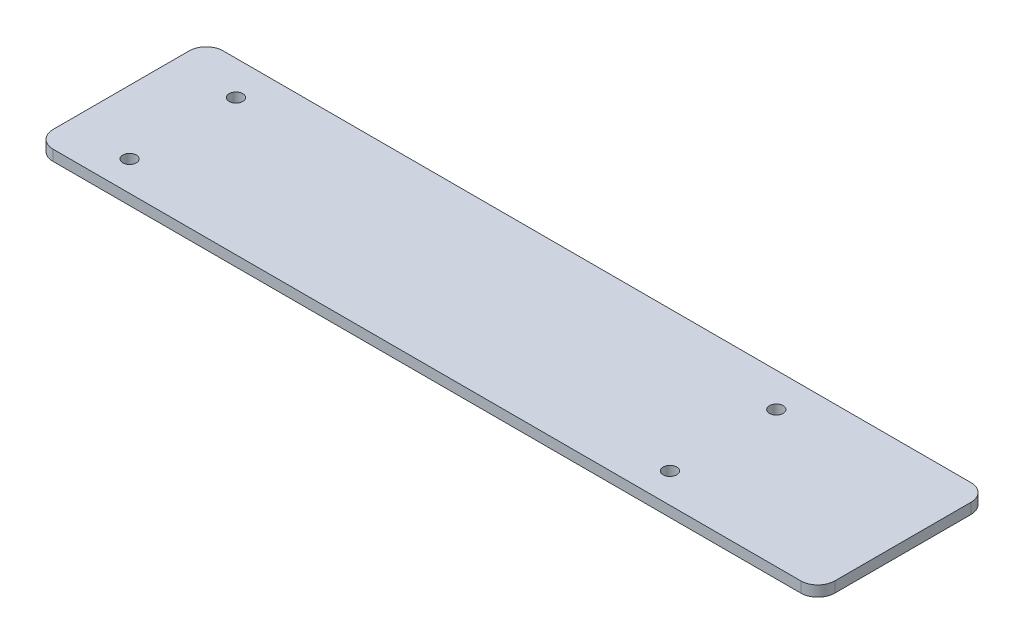
ISO-10303-21;
HEADER;
FILE_DESCRIPTION(('STEP AP214'),'2;1');
FILE_NAME('part.step','',(''),(''),'','','');
FILE_SCHEMA(('AUTOMOTIVE_DESIGN { 1 0 10303 214 1 1 1 1 }'));
ENDSEC;
DATA;
#1=APPLICATION_CONTEXT('core data for automotive mechanical design processes');
#2=APPLICATION_PROTOCOL_DEFINITION('international standard','automotive_design',2000,#1);
#3=PRODUCT_CONTEXT('',#1,'mechanical');
#4=PRODUCT('Part','Part','',(#3));
#5=PRODUCT_RELATED_PRODUCT_CATEGORY('part','',(#4));
#6=PRODUCT_DEFINITION_FORMATION('','',#4);
#7=PRODUCT_DEFINITION_CONTEXT('part definition',#1,'design');
#8=PRODUCT_DEFINITION('design','',#6,#7);
#9=PRODUCT_DEFINITION_SHAPE('','',#8);
#10=(LENGTH_UNIT() NAMED_UNIT(*) SI_UNIT(.MILLI.,.METRE.));
#11=(NAMED_UNIT(*) PLANE_ANGLE_UNIT() SI_UNIT($,.RADIAN.));
#12=(NAMED_UNIT(*) SI_UNIT($,.STERADIAN.) SOLID_ANGLE_UNIT());
#13=UNCERTAINTY_MEASURE_WITH_UNIT(LENGTH_MEASURE(1.E-05),#10,'distance_accuracy_value','');
#14=(GEOMETRIC_REPRESENTATION_CONTEXT(3) GLOBAL_UNCERTAINTY_ASSIGNED_CONTEXT((#13)) GLOBAL_UNIT_ASSIGNED_CONTEXT((#10,
#11,#12)) REPRESENTATION_CONTEXT('',''));
#15=CARTESIAN_POINT('',(0.,0.,0.));
#16=DIRECTION('',(0.,0.,1.));
#17=DIRECTION('',(1.,0.,0.));
#18=AXIS2_PLACEMENT_3D('',#15,#16,#17);
#19=CARTESIAN_POINT('',(0.,3.175,0.));
#20=DIRECTION('',(0.,1.,0.));
#21=DIRECTION('',(0.,0.,1.));
#22=AXIS2_PLACEMENT_3D('',#19,#20,#21);
#23=PLANE('',#22);
#24=CARTESIAN_POINT('',(63.65875,3.175,16.51));
#25=DIRECTION('',(0.,1.,0.));
#26=DIRECTION('',(0.,0.,1.));
#27=AXIS2_PLACEMENT_3D('',#24,#25,#26);
#28=CIRCLE('',#27,2.03200000000002);
#29=CARTESIAN_POINT('',(63.65875,3.175,18.542));
#30=VERTEX_POINT('',#29);
#31=EDGE_CURVE('E227',#30,#30,#28,.T.);
#32=ORIENTED_EDGE('',*,*,#31,.F.);
#33=EDGE_LOOP('',(#32));
#34=FACE_BOUND('',#33,.T.);
#35=CARTESIAN_POINT('',(-97.63125,3.175,-15.24));
#36=DIRECTION('',(0.,1.,0.));
#37=DIRECTION('',(0.,0.,1.));
#38=AXIS2_PLACEMENT_3D('',#35,#36,#37);
#39=CIRCLE('',#38,2.03200000000001);
#40=CARTESIAN_POINT('',(-97.63125,3.175,-13.208));
#41=VERTEX_POINT('',#40);
#42=EDGE_CURVE('E161',#41,#41,#39,.T.);
#43=ORIENTED_EDGE('',*,*,#42,.F.);
#44=EDGE_LOOP('',(#43));
#45=FACE_BOUND('',#44,.T.);
#46=DIRECTION('',(0.,0.,-1.));
#47=VECTOR('',#46,1.);
#48=CARTESIAN_POINT('',(116.68125,3.175,-25.4));
#49=LINE('',#48,#47);
#50=CARTESIAN_POINT('',(116.68125,3.175,20.32));
#51=VERTEX_POINT('',#50);
#52=CARTESIAN_POINT('',(116.68125,3.175,-20.32));
#53=VERTEX_POINT('',#52);
#54=EDGE_CURVE('E170',#51,#53,#49,.T.);
#55=ORIENTED_EDGE('',*,*,#54,.T.);
#56=CARTESIAN_POINT('',(111.60125,3.175,-20.32));
#57=DIRECTION('',(0.,1.,0.));
#58=DIRECTION('',(0.,0.,1.));
#59=AXIS2_PLACEMENT_3D('',#56,#57,#58);
#60=CIRCLE('',#59,5.08);
#61=CARTESIAN_POINT('',(111.60125,3.175,-25.4));
#62=VERTEX_POINT('',#61);
#63=EDGE_CURVE('E190',#53,#62,#60,.T.);
#64=ORIENTED_EDGE('',*,*,#63,.T.);
#65=DIRECTION('',(-1.,0.,0.));
#66=VECTOR('',#65,1.);
#67=CARTESIAN_POINT('',(-116.68125,3.175,-25.4));
#68=LINE('',#67,#66);
#69=CARTESIAN_POINT('',(-111.60125,3.175,-25.4));
#70=VERTEX_POINT('',#69);
#71=EDGE_CURVE('E141',#62,#70,#68,.T.);
#72=ORIENTED_EDGE('',*,*,#71,.T.);
#73=CARTESIAN_POINT('',(-111.60125,3.175,-20.32));
#74=DIRECTION('',(0.,1.,0.));
#75=DIRECTION('',(0.,0.,1.));
#76=AXIS2_PLACEMENT_3D('',#73,#74,#75);
#77=CIRCLE('',#76,5.08);
#78=CARTESIAN_POINT('',(-116.68125,3.175,-20.32));
#79=VERTEX_POINT('',#78);
#80=EDGE_CURVE('E178',#70,#79,#77,.T.);
#81=ORIENTED_EDGE('',*,*,#80,.T.);
#82=DIRECTION('',(0.,0.,1.));
#83=VECTOR('',#82,1.);
#84=CARTESIAN_POINT('',(-116.68125,3.175,-25.4));
#85=LINE('',#84,#83);
#86=CARTESIAN_POINT('',(-116.68125,3.175,20.32));
#87=VERTEX_POINT('',#86);
#88=EDGE_CURVE('E203',#79,#87,#85,.T.);
#89=ORIENTED_EDGE('',*,*,#88,.T.);
#90=CARTESIAN_POINT('',(-111.60125,3.175,20.32));
#91=DIRECTION('',(0.,1.,0.));
#92=DIRECTION('',(0.,0.,1.));
#93=AXIS2_PLACEMENT_3D('',#90,#91,#92);
#94=CIRCLE('',#93,5.08);
#95=CARTESIAN_POINT('',(-111.60125,3.175,25.4));
#96=VERTEX_POINT('',#95);
#97=EDGE_CURVE('E75',#87,#96,#94,.T.);
#98=ORIENTED_EDGE('',*,*,#97,.T.);
#99=DIRECTION('',(1.,0.,0.));
#100=VECTOR('',#99,1.);
#101=CARTESIAN_POINT('',(-116.68125,3.175,25.4));
#102=LINE('',#101,#100);
#103=CARTESIAN_POINT('',(111.60125,3.175,25.4));
#104=VERTEX_POINT('',#103);
#105=EDGE_CURVE('E169',#96,#104,#102,.T.);
#106=ORIENTED_EDGE('',*,*,#105,.T.);
#107=CARTESIAN_POINT('',(111.60125,3.175,20.32));
#108=DIRECTION('',(0.,1.,0.));
#109=DIRECTION('',(0.,0.,1.));
#110=AXIS2_PLACEMENT_3D('',#107,#108,#109);
#111=CIRCLE('',#110,5.08);
#112=EDGE_CURVE('E184',#104,#51,#111,.T.);
#113=ORIENTED_EDGE('',*,*,#112,.T.);
#114=EDGE_LOOP('',(#55,#64,#72,#81,#89,#98,#106,#113));
#115=FACE_BOUND('',#114,.T.);
#116=CARTESIAN_POINT('',(-97.63125,3.175,16.51));
#117=DIRECTION('',(0.,1.,0.));
#118=DIRECTION('',(0.,0.,1.));
#119=AXIS2_PLACEMENT_3D('',#116,#117,#118);
#120=CIRCLE('',#119,2.03200000000001);
#121=CARTESIAN_POINT('',(-97.63125,3.175,18.542));
#122=VERTEX_POINT('',#121);
#123=EDGE_CURVE('E219',#122,#122,#120,.T.);
#124=ORIENTED_EDGE('',*,*,#123,.F.);
#125=EDGE_LOOP('',(#124));
#126=FACE_BOUND('',#125,.T.);
#127=CARTESIAN_POINT('',(63.65875,3.175,-15.24));
#128=DIRECTION('',(0.,1.,0.));
#129=DIRECTION('',(0.,0.,1.));
#130=AXIS2_PLACEMENT_3D('',#127,#128,#129);
#131=CIRCLE('',#130,2.03200000000001);
#132=CARTESIAN_POINT('',(63.65875,3.175,-13.208));
#133=VERTEX_POINT('',#132);
#134=EDGE_CURVE('E237',#133,#133,#131,.T.);
#135=ORIENTED_EDGE('',*,*,#134,.F.);
#136=EDGE_LOOP('',(#135));
#137=FACE_BOUND('',#136,.T.);
#138=ADVANCED_FACE('F44',(#34,#45,#115,#126,#137),#23,.T.);
#139=CARTESIAN_POINT('',(0.,0.,0.));
#140=DIRECTION('',(0.,1.,0.));
#141=DIRECTION('',(0.,0.,1.));
#142=AXIS2_PLACEMENT_3D('',#139,#140,#141);
#143=PLANE('',#142);
#144=DIRECTION('',(-1.,0.,0.));
#145=VECTOR('',#144,1.);
#146=CARTESIAN_POINT('',(-116.68125,0.,-25.4));
#147=LINE('',#146,#145);
#148=CARTESIAN_POINT('',(111.60125,0.,-25.4));
#149=VERTEX_POINT('',#148);
#150=CARTESIAN_POINT('',(-111.60125,0.,-25.4));
#151=VERTEX_POINT('',#150);
#152=EDGE_CURVE('E138',#149,#151,#147,.T.);
#153=ORIENTED_EDGE('',*,*,#152,.F.);
#154=CARTESIAN_POINT('',(111.60125,0.,-20.32));
#155=DIRECTION('',(0.,1.,0.));
#156=DIRECTION('',(0.,0.,1.));
#157=AXIS2_PLACEMENT_3D('',#154,#155,#156);
#158=CIRCLE('',#157,5.08);
#159=CARTESIAN_POINT('',(116.68125,0.,-20.32));
#160=VERTEX_POINT('',#159);
#161=EDGE_CURVE('E124',#149,#160,#158,.F.);
#162=ORIENTED_EDGE('',*,*,#161,.T.);
#163=DIRECTION('',(0.,0.,-1.));
#164=VECTOR('',#163,1.);
#165=CARTESIAN_POINT('',(116.68125,0.,-25.4));
#166=LINE('',#165,#164);
#167=CARTESIAN_POINT('',(116.68125,0.,20.32));
#168=VERTEX_POINT('',#167);
#169=EDGE_CURVE('E153',#168,#160,#166,.T.);
#170=ORIENTED_EDGE('',*,*,#169,.F.);
#171=CARTESIAN_POINT('',(111.60125,0.,20.32));
#172=DIRECTION('',(0.,1.,0.));
#173=DIRECTION('',(0.,0.,1.));
#174=AXIS2_PLACEMENT_3D('',#171,#172,#173);
#175=CIRCLE('',#174,5.08);
#176=CARTESIAN_POINT('',(111.60125,0.,25.4));
#177=VERTEX_POINT('',#176);
#178=EDGE_CURVE('E133',#168,#177,#175,.F.);
#179=ORIENTED_EDGE('',*,*,#178,.T.);
#180=DIRECTION('',(1.,0.,0.));
#181=VECTOR('',#180,1.);
#182=CARTESIAN_POINT('',(-116.68125,0.,25.4));
#183=LINE('',#182,#181);
#184=CARTESIAN_POINT('',(-111.60125,0.,25.4));
#185=VERTEX_POINT('',#184);
#186=EDGE_CURVE('E158',#185,#177,#183,.T.);
#187=ORIENTED_EDGE('',*,*,#186,.F.);
#188=CARTESIAN_POINT('',(-111.60125,0.,20.32));
#189=DIRECTION('',(0.,1.,0.));
#190=DIRECTION('',(0.,0.,1.));
#191=AXIS2_PLACEMENT_3D('',#188,#189,#190);
#192=CIRCLE('',#191,5.08);
#193=CARTESIAN_POINT('',(-116.68125,0.,20.32));
#194=VERTEX_POINT('',#193);
#195=EDGE_CURVE('E171',#185,#194,#192,.F.);
#196=ORIENTED_EDGE('',*,*,#195,.T.);
#197=DIRECTION('',(0.,0.,1.));
#198=VECTOR('',#197,1.);
#199=CARTESIAN_POINT('',(-116.68125,0.,-25.4));
#200=LINE('',#199,#198);
#201=CARTESIAN_POINT('',(-116.68125,0.,-20.32));
#202=VERTEX_POINT('',#201);
#203=EDGE_CURVE('E155',#202,#194,#200,.T.);
#204=ORIENTED_EDGE('',*,*,#203,.F.);
#205=CARTESIAN_POINT('',(-111.60125,0.,-20.32));
#206=DIRECTION('',(0.,1.,0.));
#207=DIRECTION('',(0.,0.,1.));
#208=AXIS2_PLACEMENT_3D('',#205,#206,#207);
#209=CIRCLE('',#208,5.08);
#210=EDGE_CURVE('E144',#202,#151,#209,.F.);
#211=ORIENTED_EDGE('',*,*,#210,.T.);
#212=EDGE_LOOP('',(#153,#162,#170,#179,#187,#196,#204,#211));
#213=FACE_BOUND('',#212,.T.);
#214=CARTESIAN_POINT('',(-97.63125,0.,-15.24));
#215=DIRECTION('',(0.,1.,0.));
#216=DIRECTION('',(0.,0.,1.));
#217=AXIS2_PLACEMENT_3D('',#214,#215,#216);
#218=CIRCLE('',#217,2.03200000000001);
#219=CARTESIAN_POINT('',(-97.63125,0.,-13.208));
#220=VERTEX_POINT('',#219);
#221=EDGE_CURVE('E216',#220,#220,#218,.T.);
#222=ORIENTED_EDGE('',*,*,#221,.T.);
#223=EDGE_LOOP('',(#222));
#224=FACE_BOUND('',#223,.T.);
#225=CARTESIAN_POINT('',(-97.63125,0.,16.51));
#226=DIRECTION('',(0.,1.,0.));
#227=DIRECTION('',(0.,0.,1.));
#228=AXIS2_PLACEMENT_3D('',#225,#226,#227);
#229=CIRCLE('',#228,2.03200000000001);
#230=CARTESIAN_POINT('',(-97.63125,0.,18.542));
#231=VERTEX_POINT('',#230);
#232=EDGE_CURVE('E221',#231,#231,#229,.T.);
#233=ORIENTED_EDGE('',*,*,#232,.T.);
#234=EDGE_LOOP('',(#233));
#235=FACE_BOUND('',#234,.T.);
#236=CARTESIAN_POINT('',(63.65875,0.,16.51));
#237=DIRECTION('',(0.,1.,0.));
#238=DIRECTION('',(0.,0.,1.));
#239=AXIS2_PLACEMENT_3D('',#236,#237,#238);
#240=CIRCLE('',#239,2.03200000000002);
#241=CARTESIAN_POINT('',(63.65875,0.,18.542));
#242=VERTEX_POINT('',#241);
#243=EDGE_CURVE('E234',#242,#242,#240,.T.);
#244=ORIENTED_EDGE('',*,*,#243,.T.);
#245=EDGE_LOOP('',(#244));
#246=FACE_BOUND('',#245,.T.);
#247=CARTESIAN_POINT('',(63.65875,0.,-15.24));
#248=DIRECTION('',(0.,1.,0.));
#249=DIRECTION('',(0.,0.,1.));
#250=AXIS2_PLACEMENT_3D('',#247,#248,#249);
#251=CIRCLE('',#250,2.03200000000001);
#252=CARTESIAN_POINT('',(63.65875,0.,-13.208));
#253=VERTEX_POINT('',#252);
#254=EDGE_CURVE('E238',#253,#253,#251,.T.);
#255=ORIENTED_EDGE('',*,*,#254,.T.);
#256=EDGE_LOOP('',(#255));
#257=FACE_BOUND('',#256,.T.);
#258=ADVANCED_FACE('F146',(#213,#224,#235,#246,#257),#143,.F.);
#259=CARTESIAN_POINT('',(116.68125,3.175,-25.4));
#260=DIRECTION('',(-1.,0.,0.));
#261=DIRECTION('',(0.,0.,1.));
#262=AXIS2_PLACEMENT_3D('',#259,#260,#261);
#263=PLANE('',#262);
#264=ORIENTED_EDGE('',*,*,#169,.T.);
#265=DIRECTION('',(0.,-1.,0.));
#266=VECTOR('',#265,1.);
#267=CARTESIAN_POINT('',(116.68125,3.175,-20.32));
#268=LINE('',#267,#266);
#269=EDGE_CURVE('E130',#160,#53,#268,.F.);
#270=ORIENTED_EDGE('',*,*,#269,.T.);
#271=ORIENTED_EDGE('',*,*,#54,.F.);
#272=DIRECTION('',(0.,-1.,0.));
#273=VECTOR('',#272,1.);
#274=CARTESIAN_POINT('',(116.68125,3.175,20.32));
#275=LINE('',#274,#273);
#276=EDGE_CURVE('E132',#51,#168,#275,.T.);
#277=ORIENTED_EDGE('',*,*,#276,.T.);
#278=EDGE_LOOP('',(#264,#270,#271,#277));
#279=FACE_BOUND('',#278,.T.);
#280=ADVANCED_FACE('F254',(#279),#263,.F.);
#281=CARTESIAN_POINT('',(-116.68125,3.175,-25.4));
#282=DIRECTION('',(0.,0.,1.));
#283=DIRECTION('',(1.,0.,0.));
#284=AXIS2_PLACEMENT_3D('',#281,#282,#283);
#285=PLANE('',#284);
#286=ORIENTED_EDGE('',*,*,#71,.F.);
#287=DIRECTION('',(0.,-1.,0.));
#288=VECTOR('',#287,1.);
#289=CARTESIAN_POINT('',(111.60125,3.175,-25.4));
#290=LINE('',#289,#288);
#291=EDGE_CURVE('E127',#62,#149,#290,.T.);
#292=ORIENTED_EDGE('',*,*,#291,.T.);
#293=ORIENTED_EDGE('',*,*,#152,.T.);
#294=DIRECTION('',(0.,-1.,0.));
#295=VECTOR('',#294,1.);
#296=CARTESIAN_POINT('',(-111.60125,3.175,-25.4));
#297=LINE('',#296,#295);
#298=EDGE_CURVE('E148',#151,#70,#297,.F.);
#299=ORIENTED_EDGE('',*,*,#298,.T.);
#300=EDGE_LOOP('',(#286,#292,#293,#299));
#301=FACE_BOUND('',#300,.T.);
#302=ADVANCED_FACE('F136',(#301),#285,.F.);
#303=CARTESIAN_POINT('',(-116.68125,3.175,-25.4));
#304=DIRECTION('',(1.,0.,0.));
#305=DIRECTION('',(0.,0.,-1.));
#306=AXIS2_PLACEMENT_3D('',#303,#304,#305);
#307=PLANE('',#306);
#308=ORIENTED_EDGE('',*,*,#203,.T.);
#309=DIRECTION('',(0.,-1.,0.));
#310=VECTOR('',#309,1.);
#311=CARTESIAN_POINT('',(-116.68125,3.175,20.32));
#312=LINE('',#311,#310);
#313=EDGE_CURVE('E11',#194,#87,#312,.F.);
#314=ORIENTED_EDGE('',*,*,#313,.T.);
#315=ORIENTED_EDGE('',*,*,#88,.F.);
#316=DIRECTION('',(0.,-1.,0.));
#317=VECTOR('',#316,1.);
#318=CARTESIAN_POINT('',(-116.68125,3.175,-20.32));
#319=LINE('',#318,#317);
#320=EDGE_CURVE('E53',#79,#202,#319,.T.);
#321=ORIENTED_EDGE('',*,*,#320,.T.);
#322=EDGE_LOOP('',(#308,#314,#315,#321));
#323=FACE_BOUND('',#322,.T.);
#324=ADVANCED_FACE('F200',(#323),#307,.F.);
#325=CARTESIAN_POINT('',(-116.68125,3.175,25.4));
#326=DIRECTION('',(0.,0.,-1.));
#327=DIRECTION('',(-1.,0.,0.));
#328=AXIS2_PLACEMENT_3D('',#325,#326,#327);
#329=PLANE('',#328);
#330=ORIENTED_EDGE('',*,*,#186,.T.);
#331=DIRECTION('',(0.,-1.,0.));
#332=VECTOR('',#331,1.);
#333=CARTESIAN_POINT('',(111.60125,3.175,25.4));
#334=LINE('',#333,#332);
#335=EDGE_CURVE('E63',#177,#104,#334,.F.);
#336=ORIENTED_EDGE('',*,*,#335,.T.);
#337=ORIENTED_EDGE('',*,*,#105,.F.);
#338=DIRECTION('',(0.,-1.,0.));
#339=VECTOR('',#338,1.);
#340=CARTESIAN_POINT('',(-111.60125,3.175,25.4));
#341=LINE('',#340,#339);
#342=EDGE_CURVE('E189',#96,#185,#341,.T.);
#343=ORIENTED_EDGE('',*,*,#342,.T.);
#344=EDGE_LOOP('',(#330,#336,#337,#343));
#345=FACE_BOUND('',#344,.T.);
#346=ADVANCED_FACE('F208',(#345),#329,.F.);
#347=CARTESIAN_POINT('',(-97.63125,3.175,-15.24));
#348=DIRECTION('',(0.,-1.,0.));
#349=DIRECTION('',(0.,0.,-1.));
#350=AXIS2_PLACEMENT_3D('',#347,#348,#349);
#351=CYLINDRICAL_SURFACE('',#350,2.03200000000001);
#352=ORIENTED_EDGE('',*,*,#42,.T.);
#353=EDGE_LOOP('',(#352));
#354=FACE_BOUND('',#353,.T.);
#355=ORIENTED_EDGE('',*,*,#221,.F.);
#356=EDGE_LOOP('',(#355));
#357=FACE_BOUND('',#356,.T.);
#358=ADVANCED_FACE('F257',(#354,#357),#351,.F.);
#359=CARTESIAN_POINT('',(-97.63125,3.175,16.51));
#360=DIRECTION('',(0.,-1.,0.));
#361=DIRECTION('',(0.,0.,-1.));
#362=AXIS2_PLACEMENT_3D('',#359,#360,#361);
#363=CYLINDRICAL_SURFACE('',#362,2.03200000000001);
#364=ORIENTED_EDGE('',*,*,#123,.T.);
#365=EDGE_LOOP('',(#364));
#366=FACE_BOUND('',#365,.T.);
#367=ORIENTED_EDGE('',*,*,#232,.F.);
#368=EDGE_LOOP('',(#367));
#369=FACE_BOUND('',#368,.T.);
#370=ADVANCED_FACE('F289',(#366,#369),#363,.F.);
#371=CARTESIAN_POINT('',(63.65875,3.175,16.51));
#372=DIRECTION('',(0.,-1.,0.));
#373=DIRECTION('',(0.,0.,-1.));
#374=AXIS2_PLACEMENT_3D('',#371,#372,#373);
#375=CYLINDRICAL_SURFACE('',#374,2.03200000000002);
#376=ORIENTED_EDGE('',*,*,#31,.T.);
#377=EDGE_LOOP('',(#376));
#378=FACE_BOUND('',#377,.T.);
#379=ORIENTED_EDGE('',*,*,#243,.F.);
#380=EDGE_LOOP('',(#379));
#381=FACE_BOUND('',#380,.T.);
#382=ADVANCED_FACE('F288',(#378,#381),#375,.F.);
#383=CARTESIAN_POINT('',(63.65875,3.175,-15.24));
#384=DIRECTION('',(0.,-1.,0.));
#385=DIRECTION('',(0.,0.,-1.));
#386=AXIS2_PLACEMENT_3D('',#383,#384,#385);
#387=CYLINDRICAL_SURFACE('',#386,2.03200000000001);
#388=ORIENTED_EDGE('',*,*,#134,.T.);
#389=EDGE_LOOP('',(#388));
#390=FACE_BOUND('',#389,.T.);
#391=ORIENTED_EDGE('',*,*,#254,.F.);
#392=EDGE_LOOP('',(#391));
#393=FACE_BOUND('',#392,.T.);
#394=ADVANCED_FACE('F247',(#390,#393),#387,.F.);
#395=CARTESIAN_POINT('',(111.60125,3.175,-20.32));
#396=DIRECTION('',(0.,-1.,0.));
#397=DIRECTION('',(0.,0.,-1.));
#398=AXIS2_PLACEMENT_3D('',#395,#396,#397);
#399=CYLINDRICAL_SURFACE('',#398,5.08);
#400=ORIENTED_EDGE('',*,*,#63,.F.);
#401=ORIENTED_EDGE('',*,*,#269,.F.);
#402=ORIENTED_EDGE('',*,*,#161,.F.);
#403=ORIENTED_EDGE('',*,*,#291,.F.);
#404=EDGE_LOOP('',(#400,#401,#402,#403));
#405=FACE_BOUND('',#404,.T.);
#406=ADVANCED_FACE('F123',(#405),#399,.T.);
#407=CARTESIAN_POINT('',(111.60125,3.175,20.32));
#408=DIRECTION('',(0.,-1.,0.));
#409=DIRECTION('',(0.,0.,-1.));
#410=AXIS2_PLACEMENT_3D('',#407,#408,#409);
#411=CYLINDRICAL_SURFACE('',#410,5.08);
#412=ORIENTED_EDGE('',*,*,#112,.F.);
#413=ORIENTED_EDGE('',*,*,#335,.F.);
#414=ORIENTED_EDGE('',*,*,#178,.F.);
#415=ORIENTED_EDGE('',*,*,#276,.F.);
#416=EDGE_LOOP('',(#412,#413,#414,#415));
#417=FACE_BOUND('',#416,.T.);
#418=ADVANCED_FACE('F272',(#417),#411,.T.);
#419=CARTESIAN_POINT('',(-111.60125,3.175,20.32));
#420=DIRECTION('',(0.,-1.,0.));
#421=DIRECTION('',(0.,0.,-1.));
#422=AXIS2_PLACEMENT_3D('',#419,#420,#421);
#423=CYLINDRICAL_SURFACE('',#422,5.08);
#424=ORIENTED_EDGE('',*,*,#97,.F.);
#425=ORIENTED_EDGE('',*,*,#313,.F.);
#426=ORIENTED_EDGE('',*,*,#195,.F.);
#427=ORIENTED_EDGE('',*,*,#342,.F.);
#428=EDGE_LOOP('',(#424,#425,#426,#427));
#429=FACE_BOUND('',#428,.T.);
#430=ADVANCED_FACE('F210',(#429),#423,.T.);
#431=CARTESIAN_POINT('',(-111.60125,3.175,-20.32));
#432=DIRECTION('',(0.,-1.,0.));
#433=DIRECTION('',(0.,0.,-1.));
#434=AXIS2_PLACEMENT_3D('',#431,#432,#433);
#435=CYLINDRICAL_SURFACE('',#434,5.08);
#436=ORIENTED_EDGE('',*,*,#80,.F.);
#437=ORIENTED_EDGE('',*,*,#298,.F.);
#438=ORIENTED_EDGE('',*,*,#210,.F.);
#439=ORIENTED_EDGE('',*,*,#320,.F.);
#440=EDGE_LOOP('',(#436,#437,#438,#439));
#441=FACE_BOUND('',#440,.T.);
#442=ADVANCED_FACE('F50',(#441),#435,.T.);
#443=CLOSED_SHELL('',(#138,#258,#280,#302,#324,#346,#358,#370,#382,#394,#406,#418,#430,#442));
#444=MANIFOLD_SOLID_BREP('B2',#443);
#445=ADVANCED_BREP_SHAPE_REPRESENTATION('',(#18,#444),#14);
#446=SHAPE_DEFINITION_REPRESENTATION(#9,#445);
ENDSEC;
END-ISO-10303-21;
